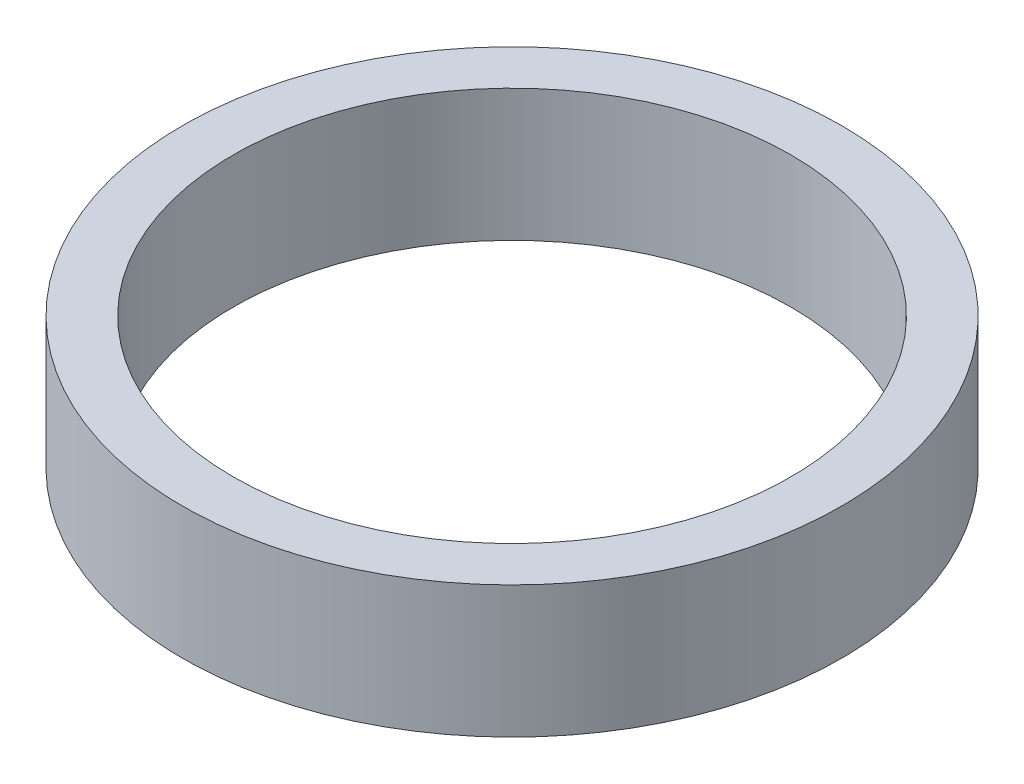
ISO-10303-21;
HEADER;
FILE_DESCRIPTION(('STEP AP214'),'2;1');
FILE_NAME('part.step','',(''),(''),'','','');
FILE_SCHEMA(('AUTOMOTIVE_DESIGN { 1 0 10303 214 1 1 1 1 }'));
ENDSEC;
DATA;
#1=APPLICATION_CONTEXT('core data for automotive mechanical design processes');
#2=APPLICATION_PROTOCOL_DEFINITION('international standard','automotive_design',2000,#1);
#3=PRODUCT_CONTEXT('',#1,'mechanical');
#4=PRODUCT('Part','Part','',(#3));
#5=PRODUCT_RELATED_PRODUCT_CATEGORY('part','',(#4));
#6=PRODUCT_DEFINITION_FORMATION('','',#4);
#7=PRODUCT_DEFINITION_CONTEXT('part definition',#1,'design');
#8=PRODUCT_DEFINITION('design','',#6,#7);
#9=PRODUCT_DEFINITION_SHAPE('','',#8);
#10=(LENGTH_UNIT() NAMED_UNIT(*) SI_UNIT(.MILLI.,.METRE.));
#11=(NAMED_UNIT(*) PLANE_ANGLE_UNIT() SI_UNIT($,.RADIAN.));
#12=(NAMED_UNIT(*) SI_UNIT($,.STERADIAN.) SOLID_ANGLE_UNIT());
#13=UNCERTAINTY_MEASURE_WITH_UNIT(LENGTH_MEASURE(1.E-05),#10,'distance_accuracy_value','');
#14=(GEOMETRIC_REPRESENTATION_CONTEXT(3) GLOBAL_UNCERTAINTY_ASSIGNED_CONTEXT((#13)) GLOBAL_UNIT_ASSIGNED_CONTEXT((#10,
#11,#12)) REPRESENTATION_CONTEXT('',''));
#15=CARTESIAN_POINT('',(0.,0.,0.));
#16=DIRECTION('',(0.,0.,1.));
#17=DIRECTION('',(1.,0.,0.));
#18=AXIS2_PLACEMENT_3D('',#15,#16,#17);
#19=CARTESIAN_POINT('',(0.,0.,0.));
#20=DIRECTION('',(0.,1.,0.));
#21=DIRECTION('',(0.,0.,1.));
#22=AXIS2_PLACEMENT_3D('',#19,#20,#21);
#23=CYLINDRICAL_SURFACE('',#22,27.5);
#24=CARTESIAN_POINT('',(0.,0.,0.));
#25=DIRECTION('',(0.,1.,0.));
#26=DIRECTION('',(0.,0.,1.));
#27=AXIS2_PLACEMENT_3D('',#24,#25,#26);
#28=CIRCLE('',#27,27.5);
#29=CARTESIAN_POINT('',(0.,0.,27.5));
#30=VERTEX_POINT('',#29);
#31=EDGE_CURVE('E26',#30,#30,#28,.F.);
#32=ORIENTED_EDGE('',*,*,#31,.T.);
#33=EDGE_LOOP('',(#32));
#34=FACE_BOUND('',#33,.T.);
#35=CARTESIAN_POINT('',(0.,13.,0.));
#36=DIRECTION('',(0.,1.,0.));
#37=DIRECTION('',(0.,0.,1.));
#38=AXIS2_PLACEMENT_3D('',#35,#36,#37);
#39=CIRCLE('',#38,27.5);
#40=CARTESIAN_POINT('',(0.,13.,27.5));
#41=VERTEX_POINT('',#40);
#42=EDGE_CURVE('E17',#41,#41,#39,.F.);
#43=ORIENTED_EDGE('',*,*,#42,.F.);
#44=EDGE_LOOP('',(#43));
#45=FACE_BOUND('',#44,.T.);
#46=ADVANCED_FACE('F14',(#34,#45),#23,.F.);
#47=CARTESIAN_POINT('',(0.,13.,0.));
#48=DIRECTION('',(0.,1.,0.));
#49=DIRECTION('',(0.,0.,1.));
#50=AXIS2_PLACEMENT_3D('',#47,#48,#49);
#51=PLANE('',#50);
#52=CARTESIAN_POINT('',(0.,13.,0.));
#53=DIRECTION('',(0.,-1.,0.));
#54=DIRECTION('',(0.,0.,-1.));
#55=AXIS2_PLACEMENT_3D('',#52,#53,#54);
#56=CIRCLE('',#55,32.5);
#57=CARTESIAN_POINT('',(0.,13.,-32.5));
#58=VERTEX_POINT('',#57);
#59=EDGE_CURVE('E21',#58,#58,#56,.T.);
#60=ORIENTED_EDGE('',*,*,#59,.F.);
#61=EDGE_LOOP('',(#60));
#62=FACE_BOUND('',#61,.T.);
#63=ORIENTED_EDGE('',*,*,#42,.T.);
#64=EDGE_LOOP('',(#63));
#65=FACE_BOUND('',#64,.T.);
#66=ADVANCED_FACE('F34',(#62,#65),#51,.T.);
#67=CARTESIAN_POINT('',(0.,0.,0.));
#68=DIRECTION('',(0.,1.,0.));
#69=DIRECTION('',(0.,0.,1.));
#70=AXIS2_PLACEMENT_3D('',#67,#68,#69);
#71=PLANE('',#70);
#72=CARTESIAN_POINT('',(0.,0.,0.));
#73=DIRECTION('',(0.,-1.,0.));
#74=DIRECTION('',(0.,0.,-1.));
#75=AXIS2_PLACEMENT_3D('',#72,#73,#74);
#76=CIRCLE('',#75,32.5);
#77=CARTESIAN_POINT('',(0.,0.,-32.5));
#78=VERTEX_POINT('',#77);
#79=EDGE_CURVE('E10',#78,#78,#76,.F.);
#80=ORIENTED_EDGE('',*,*,#79,.F.);
#81=EDGE_LOOP('',(#80));
#82=FACE_BOUND('',#81,.T.);
#83=ORIENTED_EDGE('',*,*,#31,.F.);
#84=EDGE_LOOP('',(#83));
#85=FACE_BOUND('',#84,.T.);
#86=ADVANCED_FACE('F42',(#82,#85),#71,.F.);
#87=CARTESIAN_POINT('',(0.,13.,0.));
#88=DIRECTION('',(0.,-1.,0.));
#89=DIRECTION('',(0.,0.,-1.));
#90=AXIS2_PLACEMENT_3D('',#87,#88,#89);
#91=CYLINDRICAL_SURFACE('',#90,32.5);
#92=ORIENTED_EDGE('',*,*,#79,.T.);
#93=EDGE_LOOP('',(#92));
#94=FACE_BOUND('',#93,.T.);
#95=ORIENTED_EDGE('',*,*,#59,.T.);
#96=EDGE_LOOP('',(#95));
#97=FACE_BOUND('',#96,.T.);
#98=ADVANCED_FACE('F44',(#94,#97),#91,.T.);
#99=CLOSED_SHELL('',(#46,#66,#86,#98));
#100=MANIFOLD_SOLID_BREP('B1',#99);
#101=ADVANCED_BREP_SHAPE_REPRESENTATION('',(#18,#100),#14);
#102=SHAPE_DEFINITION_REPRESENTATION(#9,#101);
ENDSEC;
END-ISO-10303-21;
